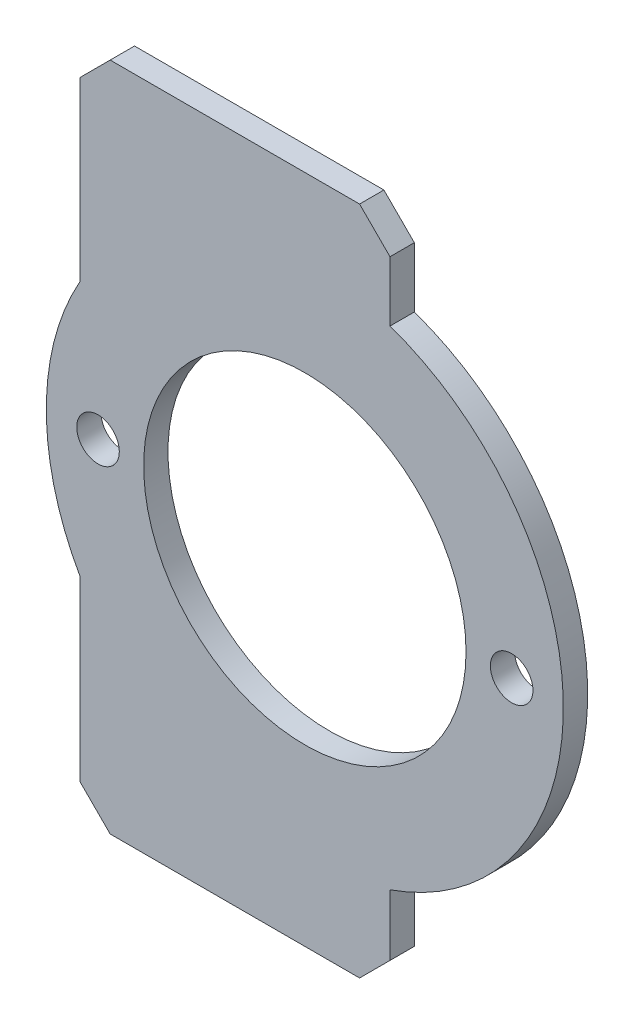
ISO-10303-21;
HEADER;
FILE_DESCRIPTION(('STEP AP214'),'2;1');
FILE_NAME('part.step','',(''),(''),'','','');
FILE_SCHEMA(('AUTOMOTIVE_DESIGN { 1 0 10303 214 1 1 1 1 }'));
ENDSEC;
DATA;
#1=APPLICATION_CONTEXT('core data for automotive mechanical design processes');
#2=APPLICATION_PROTOCOL_DEFINITION('international standard','automotive_design',2000,#1);
#3=PRODUCT_CONTEXT('',#1,'mechanical');
#4=PRODUCT('Part','Part','',(#3));
#5=PRODUCT_RELATED_PRODUCT_CATEGORY('part','',(#4));
#6=PRODUCT_DEFINITION_FORMATION('','',#4);
#7=PRODUCT_DEFINITION_CONTEXT('part definition',#1,'design');
#8=PRODUCT_DEFINITION('design','',#6,#7);
#9=PRODUCT_DEFINITION_SHAPE('','',#8);
#10=(LENGTH_UNIT() NAMED_UNIT(*) SI_UNIT(.MILLI.,.METRE.));
#11=(NAMED_UNIT(*) PLANE_ANGLE_UNIT() SI_UNIT($,.RADIAN.));
#12=(NAMED_UNIT(*) SI_UNIT($,.STERADIAN.) SOLID_ANGLE_UNIT());
#13=UNCERTAINTY_MEASURE_WITH_UNIT(LENGTH_MEASURE(1.E-05),#10,'distance_accuracy_value','');
#14=(GEOMETRIC_REPRESENTATION_CONTEXT(3) GLOBAL_UNCERTAINTY_ASSIGNED_CONTEXT((#13)) GLOBAL_UNIT_ASSIGNED_CONTEXT((#10,
#11,#12)) REPRESENTATION_CONTEXT('',''));
#15=CARTESIAN_POINT('',(0.,0.,0.));
#16=DIRECTION('',(0.,0.,1.));
#17=DIRECTION('',(1.,0.,0.));
#18=AXIS2_PLACEMENT_3D('',#15,#16,#17);
#19=CARTESIAN_POINT('',(0.,0.,-4.));
#20=DIRECTION('',(0.,0.,1.));
#21=DIRECTION('',(1.,0.,0.));
#22=AXIS2_PLACEMENT_3D('',#19,#20,#21);
#23=CYLINDRICAL_SURFACE('',#22,42.5);
#24=DIRECTION('',(0.,0.,1.));
#25=VECTOR('',#24,1.);
#26=CARTESIAN_POINT('',(-37.,-20.9105236663265,-4.));
#27=LINE('',#26,#25);
#28=CARTESIAN_POINT('',(-37.,-20.9105236663265,-4.));
#29=VERTEX_POINT('',#28);
#30=CARTESIAN_POINT('',(-37.,-20.9105236663265,0.));
#31=VERTEX_POINT('',#30);
#32=EDGE_CURVE('E149',#29,#31,#27,.T.);
#33=ORIENTED_EDGE('',*,*,#32,.T.);
#34=CARTESIAN_POINT('',(0.,0.,0.));
#35=DIRECTION('',(0.,0.,1.));
#36=DIRECTION('',(1.,0.,0.));
#37=AXIS2_PLACEMENT_3D('',#34,#35,#36);
#38=CIRCLE('',#37,42.5);
#39=CARTESIAN_POINT('',(-37.,20.9105236663265,0.));
#40=VERTEX_POINT('',#39);
#41=EDGE_CURVE('E154',#40,#31,#38,.T.);
#42=ORIENTED_EDGE('',*,*,#41,.F.);
#43=DIRECTION('',(0.,0.,1.));
#44=VECTOR('',#43,1.);
#45=CARTESIAN_POINT('',(-37.,20.9105236663265,-4.));
#46=LINE('',#45,#44);
#47=CARTESIAN_POINT('',(-37.,20.9105236663265,-4.));
#48=VERTEX_POINT('',#47);
#49=EDGE_CURVE('E221',#48,#40,#46,.T.);
#50=ORIENTED_EDGE('',*,*,#49,.F.);
#51=CARTESIAN_POINT('',(0.,0.,-4.));
#52=DIRECTION('',(0.,0.,1.));
#53=DIRECTION('',(1.,0.,0.));
#54=AXIS2_PLACEMENT_3D('',#51,#52,#53);
#55=CIRCLE('',#54,42.5);
#56=EDGE_CURVE('E153',#48,#29,#55,.T.);
#57=ORIENTED_EDGE('',*,*,#56,.T.);
#58=EDGE_LOOP('',(#33,#42,#50,#57));
#59=FACE_BOUND('',#58,.T.);
#60=ADVANCED_FACE('F39',(#59),#23,.T.);
#61=DIRECTION('',(0.,0.,1.));
#62=VECTOR('',#61,1.);
#63=CARTESIAN_POINT('',(13.999999999996,-40.127920454468,-4.));
#64=LINE('',#63,#62);
#65=CARTESIAN_POINT('',(13.999999999996,-40.127920454468,-4.));
#66=VERTEX_POINT('',#65);
#67=CARTESIAN_POINT('',(13.999999999996,-40.127920454468,0.));
#68=VERTEX_POINT('',#67);
#69=EDGE_CURVE('E134',#66,#68,#64,.T.);
#70=ORIENTED_EDGE('',*,*,#69,.F.);
#71=CARTESIAN_POINT('',(14.,40.1279204544666,-4.));
#72=VERTEX_POINT('',#71);
#73=EDGE_CURVE('E146',#66,#72,#55,.T.);
#74=ORIENTED_EDGE('',*,*,#73,.T.);
#75=DIRECTION('',(0.,0.,1.));
#76=VECTOR('',#75,1.);
#77=CARTESIAN_POINT('',(14.,40.1279204544666,-4.));
#78=LINE('',#77,#76);
#79=CARTESIAN_POINT('',(14.,40.1279204544666,0.));
#80=VERTEX_POINT('',#79);
#81=EDGE_CURVE('E218',#72,#80,#78,.T.);
#82=ORIENTED_EDGE('',*,*,#81,.T.);
#83=EDGE_CURVE('E148',#68,#80,#38,.T.);
#84=ORIENTED_EDGE('',*,*,#83,.F.);
#85=EDGE_LOOP('',(#70,#74,#82,#84));
#86=FACE_BOUND('',#85,.T.);
#87=ADVANCED_FACE('F144',(#86),#23,.T.);
#88=CARTESIAN_POINT('',(0.,0.,-4.));
#89=DIRECTION('',(0.,0.,1.));
#90=DIRECTION('',(1.,0.,0.));
#91=AXIS2_PLACEMENT_3D('',#88,#89,#90);
#92=PLANE('',#91);
#93=CARTESIAN_POINT('',(-34.,0.,-4.));
#94=DIRECTION('',(0.,0.,1.));
#95=DIRECTION('',(1.,0.,0.));
#96=AXIS2_PLACEMENT_3D('',#93,#94,#95);
#97=CIRCLE('',#96,3.5);
#98=CARTESIAN_POINT('',(-30.5,0.,-4.));
#99=VERTEX_POINT('',#98);
#100=EDGE_CURVE('E224',#99,#99,#97,.T.);
#101=ORIENTED_EDGE('',*,*,#100,.T.);
#102=EDGE_LOOP('',(#101));
#103=FACE_BOUND('',#102,.T.);
#104=CARTESIAN_POINT('',(34.,0.,-4.));
#105=DIRECTION('',(0.,0.,1.));
#106=DIRECTION('',(1.,0.,0.));
#107=AXIS2_PLACEMENT_3D('',#104,#105,#106);
#108=CIRCLE('',#107,3.5);
#109=CARTESIAN_POINT('',(37.5,0.,-4.));
#110=VERTEX_POINT('',#109);
#111=EDGE_CURVE('E230',#110,#110,#108,.T.);
#112=ORIENTED_EDGE('',*,*,#111,.T.);
#113=EDGE_LOOP('',(#112));
#114=FACE_BOUND('',#113,.T.);
#115=CARTESIAN_POINT('',(0.,0.,-4.));
#116=DIRECTION('',(0.,0.,1.));
#117=DIRECTION('',(1.,0.,0.));
#118=AXIS2_PLACEMENT_3D('',#115,#116,#117);
#119=CIRCLE('',#118,26.5);
#120=CARTESIAN_POINT('',(26.5,0.,-4.));
#121=VERTEX_POINT('',#120);
#122=EDGE_CURVE('E234',#121,#121,#119,.T.);
#123=ORIENTED_EDGE('',*,*,#122,.T.);
#124=EDGE_LOOP('',(#123));
#125=FACE_BOUND('',#124,.T.);
#126=DIRECTION('',(0.,1.,0.));
#127=VECTOR('',#126,1.);
#128=CARTESIAN_POINT('',(13.999999999996,-40.127920454468,-4.));
#129=LINE('',#128,#127);
#130=CARTESIAN_POINT('',(13.999999999996,-50.1882693519365,-4.));
#131=VERTEX_POINT('',#130);
#132=EDGE_CURVE('E130',#131,#66,#129,.T.);
#133=ORIENTED_EDGE('',*,*,#132,.F.);
#134=DIRECTION('',(0.707106781186547,0.707106781186549,0.));
#135=VECTOR('',#134,1.);
#136=CARTESIAN_POINT('',(8.99999999999602,-55.1882693519365,-4.));
#137=LINE('',#136,#135);
#138=CARTESIAN_POINT('',(8.99999999999602,-55.1882693519365,-4.));
#139=VERTEX_POINT('',#138);
#140=EDGE_CURVE('E181',#131,#139,#137,.F.);
#141=ORIENTED_EDGE('',*,*,#140,.T.);
#142=DIRECTION('',(1.,0.,0.));
#143=VECTOR('',#142,1.);
#144=CARTESIAN_POINT('',(13.999999999996,-55.1882693519365,-4.));
#145=LINE('',#144,#143);
#146=CARTESIAN_POINT('',(-32.,-55.1882693519365,-4.));
#147=VERTEX_POINT('',#146);
#148=EDGE_CURVE('E141',#147,#139,#145,.T.);
#149=ORIENTED_EDGE('',*,*,#148,.F.);
#150=DIRECTION('',(0.707106781186548,-0.707106781186547,0.));
#151=VECTOR('',#150,1.);
#152=CARTESIAN_POINT('',(-37.,-50.1882693519365,-4.));
#153=LINE('',#152,#151);
#154=CARTESIAN_POINT('',(-37.,-50.1882693519365,-4.));
#155=VERTEX_POINT('',#154);
#156=EDGE_CURVE('E179',#147,#155,#153,.F.);
#157=ORIENTED_EDGE('',*,*,#156,.T.);
#158=DIRECTION('',(0.,-1.,0.));
#159=VECTOR('',#158,1.);
#160=CARTESIAN_POINT('',(-37.,-55.1882693519365,-4.));
#161=LINE('',#160,#159);
#162=EDGE_CURVE('E140',#29,#155,#161,.T.);
#163=ORIENTED_EDGE('',*,*,#162,.F.);
#164=ORIENTED_EDGE('',*,*,#56,.F.);
#165=DIRECTION('',(0.,-1.,0.));
#166=VECTOR('',#165,1.);
#167=CARTESIAN_POINT('',(-37.,55.,-4.));
#168=LINE('',#167,#166);
#169=CARTESIAN_POINT('',(-37.,49.9999999999999,-4.));
#170=VERTEX_POINT('',#169);
#171=EDGE_CURVE('E200',#170,#48,#168,.T.);
#172=ORIENTED_EDGE('',*,*,#171,.F.);
#173=DIRECTION('',(-0.707106781186545,-0.70710678118655,0.));
#174=VECTOR('',#173,1.);
#175=CARTESIAN_POINT('',(-32.,55.,-4.));
#176=LINE('',#175,#174);
#177=CARTESIAN_POINT('',(-32.,55.,-4.));
#178=VERTEX_POINT('',#177);
#179=EDGE_CURVE('E61',#170,#178,#176,.F.);
#180=ORIENTED_EDGE('',*,*,#179,.T.);
#181=DIRECTION('',(-1.,0.,0.));
#182=VECTOR('',#181,1.);
#183=CARTESIAN_POINT('',(14.,55.,-4.));
#184=LINE('',#183,#182);
#185=CARTESIAN_POINT('',(9.00000000000001,55.,-4.));
#186=VERTEX_POINT('',#185);
#187=EDGE_CURVE('E195',#186,#178,#184,.T.);
#188=ORIENTED_EDGE('',*,*,#187,.F.);
#189=DIRECTION('',(-0.707106781186548,0.707106781186547,0.));
#190=VECTOR('',#189,1.);
#191=CARTESIAN_POINT('',(14.,50.,-4.));
#192=LINE('',#191,#190);
#193=CARTESIAN_POINT('',(14.,50.,-4.));
#194=VERTEX_POINT('',#193);
#195=EDGE_CURVE('E55',#186,#194,#192,.F.);
#196=ORIENTED_EDGE('',*,*,#195,.T.);
#197=DIRECTION('',(0.,1.,0.));
#198=VECTOR('',#197,1.);
#199=CARTESIAN_POINT('',(14.,40.1279204544666,-4.));
#200=LINE('',#199,#198);
#201=EDGE_CURVE('E152',#72,#194,#200,.T.);
#202=ORIENTED_EDGE('',*,*,#201,.F.);
#203=ORIENTED_EDGE('',*,*,#73,.F.);
#204=EDGE_LOOP('',(#133,#141,#149,#157,#163,#164,#172,#180,#188,#196,#202,#203));
#205=FACE_BOUND('',#204,.T.);
#206=ADVANCED_FACE('F151',(#103,#114,#125,#205),#92,.F.);
#207=CARTESIAN_POINT('',(0.,0.,0.));
#208=DIRECTION('',(0.,0.,1.));
#209=DIRECTION('',(1.,0.,0.));
#210=AXIS2_PLACEMENT_3D('',#207,#208,#209);
#211=PLANE('',#210);
#212=DIRECTION('',(1.,0.,0.));
#213=VECTOR('',#212,1.);
#214=CARTESIAN_POINT('',(13.999999999996,-55.1882693519365,0.));
#215=LINE('',#214,#213);
#216=CARTESIAN_POINT('',(-32.,-55.1882693519365,0.));
#217=VERTEX_POINT('',#216);
#218=CARTESIAN_POINT('',(8.99999999999602,-55.1882693519365,0.));
#219=VERTEX_POINT('',#218);
#220=EDGE_CURVE('E296',#217,#219,#215,.T.);
#221=ORIENTED_EDGE('',*,*,#220,.T.);
#222=DIRECTION('',(-0.707106781186547,-0.707106781186549,0.));
#223=VECTOR('',#222,1.);
#224=CARTESIAN_POINT('',(32.0941346759663,-32.0941346759662,0.));
#225=LINE('',#224,#223);
#226=CARTESIAN_POINT('',(13.999999999996,-50.1882693519365,0.));
#227=VERTEX_POINT('',#226);
#228=EDGE_CURVE('E174',#219,#227,#225,.F.);
#229=ORIENTED_EDGE('',*,*,#228,.T.);
#230=DIRECTION('',(0.,1.,0.));
#231=VECTOR('',#230,1.);
#232=CARTESIAN_POINT('',(13.999999999996,-40.127920454468,0.));
#233=LINE('',#232,#231);
#234=EDGE_CURVE('E294',#227,#68,#233,.T.);
#235=ORIENTED_EDGE('',*,*,#234,.T.);
#236=ORIENTED_EDGE('',*,*,#83,.T.);
#237=DIRECTION('',(0.,1.,0.));
#238=VECTOR('',#237,1.);
#239=CARTESIAN_POINT('',(14.,40.1279204544666,0.));
#240=LINE('',#239,#238);
#241=CARTESIAN_POINT('',(14.,50.,0.));
#242=VERTEX_POINT('',#241);
#243=EDGE_CURVE('E201',#80,#242,#240,.T.);
#244=ORIENTED_EDGE('',*,*,#243,.T.);
#245=DIRECTION('',(0.707106781186548,-0.707106781186547,0.));
#246=VECTOR('',#245,1.);
#247=CARTESIAN_POINT('',(32.,32.0000000000001,0.));
#248=LINE('',#247,#246);
#249=CARTESIAN_POINT('',(9.00000000000001,55.,0.));
#250=VERTEX_POINT('',#249);
#251=EDGE_CURVE('E170',#242,#250,#248,.F.);
#252=ORIENTED_EDGE('',*,*,#251,.T.);
#253=DIRECTION('',(-1.,0.,0.));
#254=VECTOR('',#253,1.);
#255=CARTESIAN_POINT('',(14.,55.,0.));
#256=LINE('',#255,#254);
#257=CARTESIAN_POINT('',(-32.,55.,0.));
#258=VERTEX_POINT('',#257);
#259=EDGE_CURVE('E198',#250,#258,#256,.T.);
#260=ORIENTED_EDGE('',*,*,#259,.T.);
#261=DIRECTION('',(0.707106781186545,0.70710678118655,0.));
#262=VECTOR('',#261,1.);
#263=CARTESIAN_POINT('',(-43.5000000000001,43.4999999999998,0.));
#264=LINE('',#263,#262);
#265=CARTESIAN_POINT('',(-37.,49.9999999999999,0.));
#266=VERTEX_POINT('',#265);
#267=EDGE_CURVE('E168',#258,#266,#264,.F.);
#268=ORIENTED_EDGE('',*,*,#267,.T.);
#269=DIRECTION('',(0.,-1.,0.));
#270=VECTOR('',#269,1.);
#271=CARTESIAN_POINT('',(-37.,55.,0.));
#272=LINE('',#271,#270);
#273=EDGE_CURVE('E213',#266,#40,#272,.T.);
#274=ORIENTED_EDGE('',*,*,#273,.T.);
#275=ORIENTED_EDGE('',*,*,#41,.T.);
#276=DIRECTION('',(0.,-1.,0.));
#277=VECTOR('',#276,1.);
#278=CARTESIAN_POINT('',(-37.,-55.1882693519365,0.));
#279=LINE('',#278,#277);
#280=CARTESIAN_POINT('',(-37.,-50.1882693519365,0.));
#281=VERTEX_POINT('',#280);
#282=EDGE_CURVE('E291',#31,#281,#279,.T.);
#283=ORIENTED_EDGE('',*,*,#282,.T.);
#284=DIRECTION('',(-0.707106781186548,0.707106781186547,0.));
#285=VECTOR('',#284,1.);
#286=CARTESIAN_POINT('',(-43.5941346759682,-43.5941346759683,0.));
#287=LINE('',#286,#285);
#288=EDGE_CURVE('E172',#281,#217,#287,.F.);
#289=ORIENTED_EDGE('',*,*,#288,.T.);
#290=EDGE_LOOP('',(#221,#229,#235,#236,#244,#252,#260,#268,#274,#275,#283,#289));
#291=FACE_BOUND('',#290,.T.);
#292=CARTESIAN_POINT('',(-34.,0.,0.));
#293=DIRECTION('',(0.,0.,1.));
#294=DIRECTION('',(1.,0.,0.));
#295=AXIS2_PLACEMENT_3D('',#292,#293,#294);
#296=CIRCLE('',#295,3.5);
#297=CARTESIAN_POINT('',(-30.5,0.,0.));
#298=VERTEX_POINT('',#297);
#299=EDGE_CURVE('E220',#298,#298,#296,.T.);
#300=ORIENTED_EDGE('',*,*,#299,.F.);
#301=EDGE_LOOP('',(#300));
#302=FACE_BOUND('',#301,.T.);
#303=CARTESIAN_POINT('',(34.,0.,0.));
#304=DIRECTION('',(0.,0.,1.));
#305=DIRECTION('',(1.,0.,0.));
#306=AXIS2_PLACEMENT_3D('',#303,#304,#305);
#307=CIRCLE('',#306,3.5);
#308=CARTESIAN_POINT('',(37.5,0.,0.));
#309=VERTEX_POINT('',#308);
#310=EDGE_CURVE('E227',#309,#309,#307,.T.);
#311=ORIENTED_EDGE('',*,*,#310,.F.);
#312=EDGE_LOOP('',(#311));
#313=FACE_BOUND('',#312,.T.);
#314=CARTESIAN_POINT('',(0.,0.,0.));
#315=DIRECTION('',(0.,0.,1.));
#316=DIRECTION('',(1.,0.,0.));
#317=AXIS2_PLACEMENT_3D('',#314,#315,#316);
#318=CIRCLE('',#317,26.5);
#319=CARTESIAN_POINT('',(26.5,0.,0.));
#320=VERTEX_POINT('',#319);
#321=EDGE_CURVE('E161',#320,#320,#318,.T.);
#322=ORIENTED_EDGE('',*,*,#321,.F.);
#323=EDGE_LOOP('',(#322));
#324=FACE_BOUND('',#323,.T.);
#325=ADVANCED_FACE('F211',(#291,#302,#313,#324),#211,.T.);
#326=CARTESIAN_POINT('',(0.,0.,-4.));
#327=DIRECTION('',(0.,0.,1.));
#328=DIRECTION('',(1.,0.,0.));
#329=AXIS2_PLACEMENT_3D('',#326,#327,#328);
#330=CYLINDRICAL_SURFACE('',#329,26.5);
#331=ORIENTED_EDGE('',*,*,#122,.F.);
#332=EDGE_LOOP('',(#331));
#333=FACE_BOUND('',#332,.T.);
#334=ORIENTED_EDGE('',*,*,#321,.T.);
#335=EDGE_LOOP('',(#334));
#336=FACE_BOUND('',#335,.T.);
#337=ADVANCED_FACE('F241',(#333,#336),#330,.F.);
#338=CARTESIAN_POINT('',(34.,0.,-4.));
#339=DIRECTION('',(0.,0.,1.));
#340=DIRECTION('',(1.,0.,0.));
#341=AXIS2_PLACEMENT_3D('',#338,#339,#340);
#342=CYLINDRICAL_SURFACE('',#341,3.5);
#343=ORIENTED_EDGE('',*,*,#111,.F.);
#344=EDGE_LOOP('',(#343));
#345=FACE_BOUND('',#344,.T.);
#346=ORIENTED_EDGE('',*,*,#310,.T.);
#347=EDGE_LOOP('',(#346));
#348=FACE_BOUND('',#347,.T.);
#349=ADVANCED_FACE('F249',(#345,#348),#342,.F.);
#350=CARTESIAN_POINT('',(-34.,0.,-4.));
#351=DIRECTION('',(0.,0.,1.));
#352=DIRECTION('',(1.,0.,0.));
#353=AXIS2_PLACEMENT_3D('',#350,#351,#352);
#354=CYLINDRICAL_SURFACE('',#353,3.5);
#355=ORIENTED_EDGE('',*,*,#100,.F.);
#356=EDGE_LOOP('',(#355));
#357=FACE_BOUND('',#356,.T.);
#358=ORIENTED_EDGE('',*,*,#299,.T.);
#359=EDGE_LOOP('',(#358));
#360=FACE_BOUND('',#359,.T.);
#361=ADVANCED_FACE('F328',(#357,#360),#354,.F.);
#362=CARTESIAN_POINT('',(14.,55.,-4.));
#363=DIRECTION('',(0.,1.,0.));
#364=DIRECTION('',(-1.,0.,0.));
#365=AXIS2_PLACEMENT_3D('',#362,#363,#364);
#366=PLANE('',#365);
#367=ORIENTED_EDGE('',*,*,#259,.F.);
#368=DIRECTION('',(0.,0.,-1.));
#369=VECTOR('',#368,1.);
#370=CARTESIAN_POINT('',(9.00000000000001,55.,-4.));
#371=LINE('',#370,#369);
#372=EDGE_CURVE('E48',#250,#186,#371,.T.);
#373=ORIENTED_EDGE('',*,*,#372,.T.);
#374=ORIENTED_EDGE('',*,*,#187,.T.);
#375=DIRECTION('',(0.,0.,1.));
#376=VECTOR('',#375,1.);
#377=CARTESIAN_POINT('',(-32.,55.,-4.));
#378=LINE('',#377,#376);
#379=EDGE_CURVE('E189',#178,#258,#378,.T.);
#380=ORIENTED_EDGE('',*,*,#379,.T.);
#381=EDGE_LOOP('',(#367,#373,#374,#380));
#382=FACE_BOUND('',#381,.T.);
#383=ADVANCED_FACE('F194',(#382),#366,.T.);
#384=CARTESIAN_POINT('',(14.,40.1279204544666,-4.));
#385=DIRECTION('',(1.,0.,0.));
#386=DIRECTION('',(0.,0.,-1.));
#387=AXIS2_PLACEMENT_3D('',#384,#385,#386);
#388=PLANE('',#387);
#389=ORIENTED_EDGE('',*,*,#201,.T.);
#390=DIRECTION('',(0.,0.,1.));
#391=VECTOR('',#390,1.);
#392=CARTESIAN_POINT('',(14.,50.,-4.));
#393=LINE('',#392,#391);
#394=EDGE_CURVE('E186',#194,#242,#393,.T.);
#395=ORIENTED_EDGE('',*,*,#394,.T.);
#396=ORIENTED_EDGE('',*,*,#243,.F.);
#397=ORIENTED_EDGE('',*,*,#81,.F.);
#398=EDGE_LOOP('',(#389,#395,#396,#397));
#399=FACE_BOUND('',#398,.T.);
#400=ADVANCED_FACE('F208',(#399),#388,.T.);
#401=CARTESIAN_POINT('',(-37.,55.,-4.));
#402=DIRECTION('',(-1.,0.,0.));
#403=DIRECTION('',(0.,-1.,0.));
#404=AXIS2_PLACEMENT_3D('',#401,#402,#403);
#405=PLANE('',#404);
#406=ORIENTED_EDGE('',*,*,#273,.F.);
#407=DIRECTION('',(0.,0.,-1.));
#408=VECTOR('',#407,1.);
#409=CARTESIAN_POINT('',(-37.,49.9999999999999,-4.));
#410=LINE('',#409,#408);
#411=EDGE_CURVE('E11',#266,#170,#410,.T.);
#412=ORIENTED_EDGE('',*,*,#411,.T.);
#413=ORIENTED_EDGE('',*,*,#171,.T.);
#414=ORIENTED_EDGE('',*,*,#49,.T.);
#415=EDGE_LOOP('',(#406,#412,#413,#414));
#416=FACE_BOUND('',#415,.T.);
#417=ADVANCED_FACE('F316',(#416),#405,.T.);
#418=CARTESIAN_POINT('',(13.999999999996,-55.1882693519365,-4.));
#419=DIRECTION('',(0.,-1.,0.));
#420=DIRECTION('',(1.,0.,0.));
#421=AXIS2_PLACEMENT_3D('',#418,#419,#420);
#422=PLANE('',#421);
#423=ORIENTED_EDGE('',*,*,#148,.T.);
#424=DIRECTION('',(0.,0.,1.));
#425=VECTOR('',#424,1.);
#426=CARTESIAN_POINT('',(8.99999999999602,-55.1882693519365,-4.));
#427=LINE('',#426,#425);
#428=EDGE_CURVE('E165',#139,#219,#427,.T.);
#429=ORIENTED_EDGE('',*,*,#428,.T.);
#430=ORIENTED_EDGE('',*,*,#220,.F.);
#431=DIRECTION('',(0.,0.,-1.));
#432=VECTOR('',#431,1.);
#433=CARTESIAN_POINT('',(-32.,-55.1882693519365,-4.));
#434=LINE('',#433,#432);
#435=EDGE_CURVE('E157',#217,#147,#434,.T.);
#436=ORIENTED_EDGE('',*,*,#435,.T.);
#437=EDGE_LOOP('',(#423,#429,#430,#436));
#438=FACE_BOUND('',#437,.T.);
#439=ADVANCED_FACE('F304',(#438),#422,.T.);
#440=CARTESIAN_POINT('',(-37.,-55.1882693519365,-4.));
#441=DIRECTION('',(-1.,0.,0.));
#442=DIRECTION('',(0.,0.,1.));
#443=AXIS2_PLACEMENT_3D('',#440,#441,#442);
#444=PLANE('',#443);
#445=ORIENTED_EDGE('',*,*,#162,.T.);
#446=DIRECTION('',(0.,0.,1.));
#447=VECTOR('',#446,1.);
#448=CARTESIAN_POINT('',(-37.,-50.1882693519365,-4.));
#449=LINE('',#448,#447);
#450=EDGE_CURVE('E183',#155,#281,#449,.T.);
#451=ORIENTED_EDGE('',*,*,#450,.T.);
#452=ORIENTED_EDGE('',*,*,#282,.F.);
#453=ORIENTED_EDGE('',*,*,#32,.F.);
#454=EDGE_LOOP('',(#445,#451,#452,#453));
#455=FACE_BOUND('',#454,.T.);
#456=ADVANCED_FACE('F312',(#455),#444,.T.);
#457=CARTESIAN_POINT('',(13.999999999996,-40.127920454468,-4.));
#458=DIRECTION('',(1.,0.,0.));
#459=DIRECTION('',(0.,1.,0.));
#460=AXIS2_PLACEMENT_3D('',#457,#458,#459);
#461=PLANE('',#460);
#462=ORIENTED_EDGE('',*,*,#234,.F.);
#463=DIRECTION('',(0.,0.,-1.));
#464=VECTOR('',#463,1.);
#465=CARTESIAN_POINT('',(13.999999999996,-50.1882693519365,-4.));
#466=LINE('',#465,#464);
#467=EDGE_CURVE('E137',#227,#131,#466,.T.);
#468=ORIENTED_EDGE('',*,*,#467,.T.);
#469=ORIENTED_EDGE('',*,*,#132,.T.);
#470=ORIENTED_EDGE('',*,*,#69,.T.);
#471=EDGE_LOOP('',(#462,#468,#469,#470));
#472=FACE_BOUND('',#471,.T.);
#473=ADVANCED_FACE('F133',(#472),#461,.T.);
#474=CARTESIAN_POINT('',(8.99999999999602,-55.1882693519365,-4.));
#475=DIRECTION('',(-0.707106781186548,0.707106781186546,0.));
#476=DIRECTION('',(0.,0.,1.));
#477=AXIS2_PLACEMENT_3D('',#474,#475,#476);
#478=PLANE('',#477);
#479=ORIENTED_EDGE('',*,*,#140,.F.);
#480=ORIENTED_EDGE('',*,*,#467,.F.);
#481=ORIENTED_EDGE('',*,*,#228,.F.);
#482=ORIENTED_EDGE('',*,*,#428,.F.);
#483=EDGE_LOOP('',(#479,#480,#481,#482));
#484=FACE_BOUND('',#483,.T.);
#485=ADVANCED_FACE('F263',(#484),#478,.F.);
#486=CARTESIAN_POINT('',(-37.,-50.1882693519365,-4.));
#487=DIRECTION('',(0.707106781186547,0.707106781186548,0.));
#488=DIRECTION('',(0.,0.,1.));
#489=AXIS2_PLACEMENT_3D('',#486,#487,#488);
#490=PLANE('',#489);
#491=ORIENTED_EDGE('',*,*,#156,.F.);
#492=ORIENTED_EDGE('',*,*,#435,.F.);
#493=ORIENTED_EDGE('',*,*,#288,.F.);
#494=ORIENTED_EDGE('',*,*,#450,.F.);
#495=EDGE_LOOP('',(#491,#492,#493,#494));
#496=FACE_BOUND('',#495,.T.);
#497=ADVANCED_FACE('F269',(#496),#490,.F.);
#498=CARTESIAN_POINT('',(14.,50.,-4.));
#499=DIRECTION('',(-0.707106781186547,-0.707106781186548,0.));
#500=DIRECTION('',(0.,0.,1.));
#501=AXIS2_PLACEMENT_3D('',#498,#499,#500);
#502=PLANE('',#501);
#503=ORIENTED_EDGE('',*,*,#195,.F.);
#504=ORIENTED_EDGE('',*,*,#372,.F.);
#505=ORIENTED_EDGE('',*,*,#251,.F.);
#506=ORIENTED_EDGE('',*,*,#394,.F.);
#507=EDGE_LOOP('',(#503,#504,#505,#506));
#508=FACE_BOUND('',#507,.T.);
#509=ADVANCED_FACE('F204',(#508),#502,.F.);
#510=CARTESIAN_POINT('',(-32.,55.,-4.));
#511=DIRECTION('',(0.70710678118655,-0.707106781186545,0.));
#512=DIRECTION('',(0.,0.,1.));
#513=AXIS2_PLACEMENT_3D('',#510,#511,#512);
#514=PLANE('',#513);
#515=ORIENTED_EDGE('',*,*,#179,.F.);
#516=ORIENTED_EDGE('',*,*,#411,.F.);
#517=ORIENTED_EDGE('',*,*,#267,.F.);
#518=ORIENTED_EDGE('',*,*,#379,.F.);
#519=EDGE_LOOP('',(#515,#516,#517,#518));
#520=FACE_BOUND('',#519,.T.);
#521=ADVANCED_FACE('F42',(#520),#514,.F.);
#522=CLOSED_SHELL('',(#60,#87,#206,#325,#337,#349,#361,#383,#400,#417,#439,#456,#473,#485,#497,
#509,#521));
#523=MANIFOLD_SOLID_BREP('B2',#522);
#524=ADVANCED_BREP_SHAPE_REPRESENTATION('',(#18,#523),#14);
#525=SHAPE_DEFINITION_REPRESENTATION(#9,#524);
ENDSEC;
END-ISO-10303-21;
